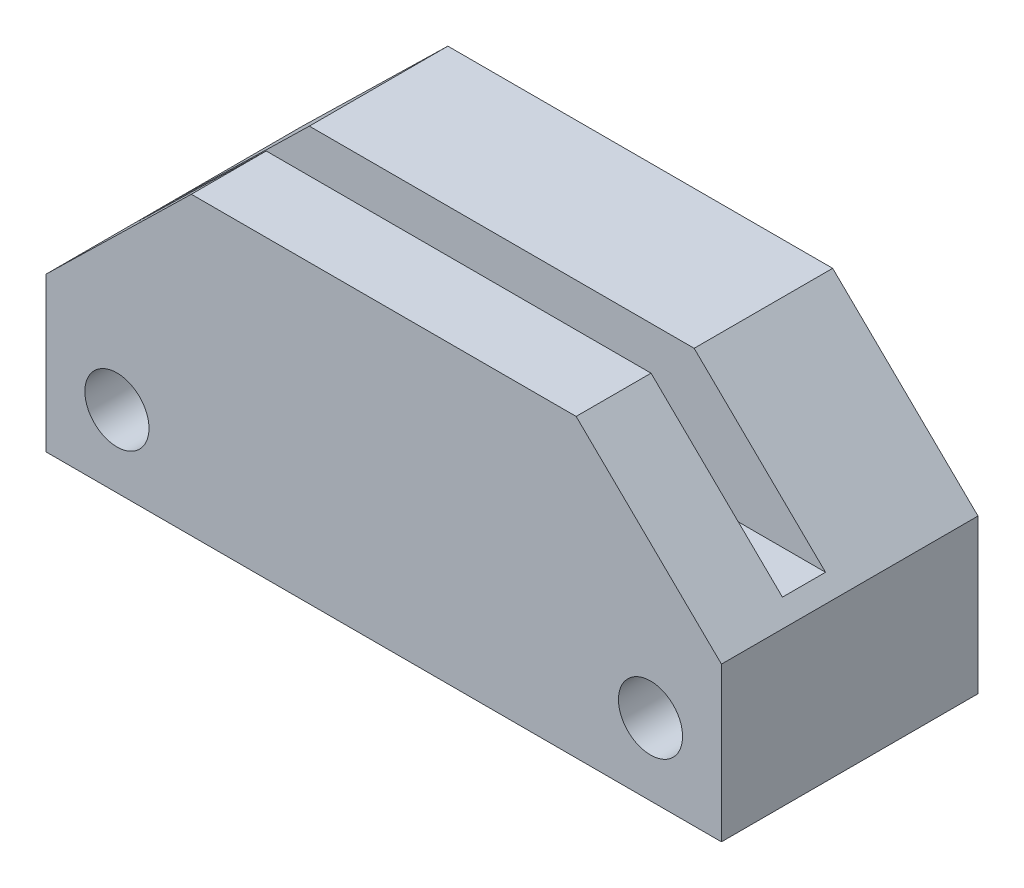
ISO-10303-21;
HEADER;
FILE_DESCRIPTION(('STEP AP214'),'2;1');
FILE_NAME('part.step','',(''),(''),'','','');
FILE_SCHEMA(('AUTOMOTIVE_DESIGN { 1 0 10303 214 1 1 1 1 }'));
ENDSEC;
DATA;
#1=APPLICATION_CONTEXT('core data for automotive mechanical design processes');
#2=APPLICATION_PROTOCOL_DEFINITION('international standard','automotive_design',2000,#1);
#3=PRODUCT_CONTEXT('',#1,'mechanical');
#4=PRODUCT('Part','Part','',(#3));
#5=PRODUCT_RELATED_PRODUCT_CATEGORY('part','',(#4));
#6=PRODUCT_DEFINITION_FORMATION('','',#4);
#7=PRODUCT_DEFINITION_CONTEXT('part definition',#1,'design');
#8=PRODUCT_DEFINITION('design','',#6,#7);
#9=PRODUCT_DEFINITION_SHAPE('','',#8);
#10=(LENGTH_UNIT() NAMED_UNIT(*) SI_UNIT(.MILLI.,.METRE.));
#11=(NAMED_UNIT(*) PLANE_ANGLE_UNIT() SI_UNIT($,.RADIAN.));
#12=(NAMED_UNIT(*) SI_UNIT($,.STERADIAN.) SOLID_ANGLE_UNIT());
#13=UNCERTAINTY_MEASURE_WITH_UNIT(LENGTH_MEASURE(1.E-05),#10,'distance_accuracy_value','');
#14=(GEOMETRIC_REPRESENTATION_CONTEXT(3) GLOBAL_UNCERTAINTY_ASSIGNED_CONTEXT((#13)) GLOBAL_UNIT_ASSIGNED_CONTEXT((#10,
#11,#12)) REPRESENTATION_CONTEXT('',''));
#15=CARTESIAN_POINT('',(0.,0.,0.));
#16=DIRECTION('',(0.,0.,1.));
#17=DIRECTION('',(1.,0.,0.));
#18=AXIS2_PLACEMENT_3D('',#15,#16,#17);
#19=CARTESIAN_POINT('',(5.665,11.53,10.));
#20=DIRECTION('',(0.,-1.,0.));
#21=DIRECTION('',(0.,0.,-1.));
#22=AXIS2_PLACEMENT_3D('',#19,#20,#21);
#23=PLANE('',#22);
#24=DIRECTION('',(0.,0.,-1.));
#25=VECTOR('',#24,1.);
#26=CARTESIAN_POINT('',(5.665,11.53,10.));
#27=LINE('',#26,#25);
#28=CARTESIAN_POINT('',(5.665,11.53,5.4));
#29=VERTEX_POINT('',#28);
#30=CARTESIAN_POINT('',(5.665,11.53,0.));
#31=VERTEX_POINT('',#30);
#32=EDGE_CURVE('E153',#29,#31,#27,.T.);
#33=ORIENTED_EDGE('',*,*,#32,.F.);
#34=DIRECTION('',(-1.,0.,0.));
#35=VECTOR('',#34,1.);
#36=CARTESIAN_POINT('',(0.,11.53,5.4));
#37=LINE('',#36,#35);
#38=CARTESIAN_POINT('',(20.665,11.53,5.4));
#39=VERTEX_POINT('',#38);
#40=EDGE_CURVE('E177',#39,#29,#37,.T.);
#41=ORIENTED_EDGE('',*,*,#40,.F.);
#42=DIRECTION('',(0.,0.,-1.));
#43=VECTOR('',#42,1.);
#44=CARTESIAN_POINT('',(20.665,11.53,10.));
#45=LINE('',#44,#43);
#46=CARTESIAN_POINT('',(20.665,11.53,0.));
#47=VERTEX_POINT('',#46);
#48=EDGE_CURVE('E126',#39,#47,#45,.T.);
#49=ORIENTED_EDGE('',*,*,#48,.T.);
#50=DIRECTION('',(-1.,0.,0.));
#51=VECTOR('',#50,1.);
#52=CARTESIAN_POINT('',(5.665,11.53,0.));
#53=LINE('',#52,#51);
#54=EDGE_CURVE('E147',#47,#31,#53,.T.);
#55=ORIENTED_EDGE('',*,*,#54,.T.);
#56=EDGE_LOOP('',(#33,#41,#49,#55));
#57=FACE_BOUND('',#56,.T.);
#58=ADVANCED_FACE('F34',(#57),#23,.F.);
#59=CARTESIAN_POINT('',(0.,0.,10.));
#60=DIRECTION('',(1.,0.,0.));
#61=DIRECTION('',(0.,0.,-1.));
#62=AXIS2_PLACEMENT_3D('',#59,#60,#61);
#63=PLANE('',#62);
#64=DIRECTION('',(0.,-1.,0.));
#65=VECTOR('',#64,1.);
#66=CARTESIAN_POINT('',(0.,0.,0.));
#67=LINE('',#66,#65);
#68=CARTESIAN_POINT('',(0.,6.,0.));
#69=VERTEX_POINT('',#68);
#70=CARTESIAN_POINT('',(0.,0.,0.));
#71=VERTEX_POINT('',#70);
#72=EDGE_CURVE('E136',#69,#71,#67,.T.);
#73=ORIENTED_EDGE('',*,*,#72,.T.);
#74=DIRECTION('',(0.,0.,-1.));
#75=VECTOR('',#74,1.);
#76=CARTESIAN_POINT('',(0.,0.,10.));
#77=LINE('',#76,#75);
#78=CARTESIAN_POINT('',(0.,0.,10.));
#79=VERTEX_POINT('',#78);
#80=EDGE_CURVE('E159',#79,#71,#77,.T.);
#81=ORIENTED_EDGE('',*,*,#80,.F.);
#82=DIRECTION('',(0.,-1.,0.));
#83=VECTOR('',#82,1.);
#84=CARTESIAN_POINT('',(0.,0.,10.));
#85=LINE('',#84,#83);
#86=CARTESIAN_POINT('',(0.,6.,10.));
#87=VERTEX_POINT('',#86);
#88=EDGE_CURVE('E151',#87,#79,#85,.T.);
#89=ORIENTED_EDGE('',*,*,#88,.F.);
#90=DIRECTION('',(0.,0.,-1.));
#91=VECTOR('',#90,1.);
#92=CARTESIAN_POINT('',(0.,6.,10.));
#93=LINE('',#92,#91);
#94=EDGE_CURVE('E132',#87,#69,#93,.T.);
#95=ORIENTED_EDGE('',*,*,#94,.T.);
#96=EDGE_LOOP('',(#73,#81,#89,#95));
#97=FACE_BOUND('',#96,.T.);
#98=ADVANCED_FACE('F36',(#97),#63,.F.);
#99=CARTESIAN_POINT('',(0.,0.,10.));
#100=DIRECTION('',(0.,1.,0.));
#101=DIRECTION('',(0.,0.,1.));
#102=AXIS2_PLACEMENT_3D('',#99,#100,#101);
#103=PLANE('',#102);
#104=DIRECTION('',(1.,0.,0.));
#105=VECTOR('',#104,1.);
#106=CARTESIAN_POINT('',(0.,0.,0.));
#107=LINE('',#106,#105);
#108=CARTESIAN_POINT('',(26.33,0.,0.));
#109=VERTEX_POINT('',#108);
#110=EDGE_CURVE('E139',#71,#109,#107,.T.);
#111=ORIENTED_EDGE('',*,*,#110,.T.);
#112=DIRECTION('',(0.,0.,-1.));
#113=VECTOR('',#112,1.);
#114=CARTESIAN_POINT('',(26.33,0.,10.));
#115=LINE('',#114,#113);
#116=CARTESIAN_POINT('',(26.33,0.,10.));
#117=VERTEX_POINT('',#116);
#118=EDGE_CURVE('E156',#117,#109,#115,.T.);
#119=ORIENTED_EDGE('',*,*,#118,.F.);
#120=DIRECTION('',(1.,0.,0.));
#121=VECTOR('',#120,1.);
#122=CARTESIAN_POINT('',(0.,0.,10.));
#123=LINE('',#122,#121);
#124=EDGE_CURVE('E93',#79,#117,#123,.T.);
#125=ORIENTED_EDGE('',*,*,#124,.F.);
#126=ORIENTED_EDGE('',*,*,#80,.T.);
#127=EDGE_LOOP('',(#111,#119,#125,#126));
#128=FACE_BOUND('',#127,.T.);
#129=ADVANCED_FACE('F196',(#128),#103,.F.);
#130=CARTESIAN_POINT('',(26.33,0.,10.));
#131=DIRECTION('',(-1.,0.,0.));
#132=DIRECTION('',(0.,0.,1.));
#133=AXIS2_PLACEMENT_3D('',#130,#131,#132);
#134=PLANE('',#133);
#135=DIRECTION('',(0.,1.,0.));
#136=VECTOR('',#135,1.);
#137=CARTESIAN_POINT('',(26.33,0.,0.));
#138=LINE('',#137,#136);
#139=CARTESIAN_POINT('',(26.33,6.,0.));
#140=VERTEX_POINT('',#139);
#141=EDGE_CURVE('E142',#109,#140,#138,.T.);
#142=ORIENTED_EDGE('',*,*,#141,.T.);
#143=DIRECTION('',(0.,0.,-1.));
#144=VECTOR('',#143,1.);
#145=CARTESIAN_POINT('',(26.33,6.,10.));
#146=LINE('',#145,#144);
#147=CARTESIAN_POINT('',(26.33,6.,10.));
#148=VERTEX_POINT('',#147);
#149=EDGE_CURVE('E125',#148,#140,#146,.T.);
#150=ORIENTED_EDGE('',*,*,#149,.F.);
#151=DIRECTION('',(0.,1.,0.));
#152=VECTOR('',#151,1.);
#153=CARTESIAN_POINT('',(26.33,0.,10.));
#154=LINE('',#153,#152);
#155=EDGE_CURVE('E109',#117,#148,#154,.T.);
#156=ORIENTED_EDGE('',*,*,#155,.F.);
#157=ORIENTED_EDGE('',*,*,#118,.T.);
#158=EDGE_LOOP('',(#142,#150,#156,#157));
#159=FACE_BOUND('',#158,.T.);
#160=ADVANCED_FACE('F199',(#159),#134,.F.);
#161=CARTESIAN_POINT('',(20.665,11.53,10.));
#162=DIRECTION('',(-0.698529024771554,-0.715581722482975,0.));
#163=DIRECTION('',(0.715581722482975,-0.698529024771554,0.));
#164=AXIS2_PLACEMENT_3D('',#161,#162,#163);
#165=PLANE('',#164);
#166=ORIENTED_EDGE('',*,*,#48,.F.);
#167=DIRECTION('',(0.715581722482975,-0.698529024771554,0.));
#168=VECTOR('',#167,1.);
#169=CARTESIAN_POINT('',(20.665,11.53,5.4));
#170=LINE('',#169,#168);
#171=CARTESIAN_POINT('',(25.787061482821,6.53,5.4));
#172=VERTEX_POINT('',#171);
#173=EDGE_CURVE('E140',#39,#172,#170,.T.);
#174=ORIENTED_EDGE('',*,*,#173,.T.);
#175=DIRECTION('',(0.,0.,-1.));
#176=VECTOR('',#175,1.);
#177=CARTESIAN_POINT('',(25.787061482821,6.53,10.));
#178=LINE('',#177,#176);
#179=CARTESIAN_POINT('',(25.787061482821,6.53,7.08));
#180=VERTEX_POINT('',#179);
#181=EDGE_CURVE('E188',#180,#172,#178,.T.);
#182=ORIENTED_EDGE('',*,*,#181,.F.);
#183=DIRECTION('',(-0.715581722482975,0.698529024771554,0.));
#184=VECTOR('',#183,1.);
#185=CARTESIAN_POINT('',(20.665,11.53,7.08));
#186=LINE('',#185,#184);
#187=CARTESIAN_POINT('',(20.665,11.53,7.08));
#188=VERTEX_POINT('',#187);
#189=EDGE_CURVE('E122',#180,#188,#186,.T.);
#190=ORIENTED_EDGE('',*,*,#189,.T.);
#191=CARTESIAN_POINT('',(20.665,11.53,10.));
#192=VERTEX_POINT('',#191);
#193=EDGE_CURVE('E116',#192,#188,#45,.T.);
#194=ORIENTED_EDGE('',*,*,#193,.F.);
#195=DIRECTION('',(-0.715581722482975,0.698529024771554,0.));
#196=VECTOR('',#195,1.);
#197=CARTESIAN_POINT('',(20.665,11.53,10.));
#198=LINE('',#197,#196);
#199=EDGE_CURVE('E102',#148,#192,#198,.T.);
#200=ORIENTED_EDGE('',*,*,#199,.F.);
#201=ORIENTED_EDGE('',*,*,#149,.T.);
#202=DIRECTION('',(-0.715581722482975,0.698529024771554,0.));
#203=VECTOR('',#202,1.);
#204=CARTESIAN_POINT('',(20.665,11.53,0.));
#205=LINE('',#204,#203);
#206=EDGE_CURVE('E144',#140,#47,#205,.T.);
#207=ORIENTED_EDGE('',*,*,#206,.T.);
#208=EDGE_LOOP('',(#166,#174,#182,#190,#194,#200,#201,#207));
#209=FACE_BOUND('',#208,.T.);
#210=ADVANCED_FACE('F118',(#209),#165,.F.);
#211=ORIENTED_EDGE('',*,*,#193,.T.);
#212=DIRECTION('',(1.,0.,0.));
#213=VECTOR('',#212,1.);
#214=CARTESIAN_POINT('',(0.,11.53,7.08));
#215=LINE('',#214,#213);
#216=CARTESIAN_POINT('',(5.665,11.53,7.08));
#217=VERTEX_POINT('',#216);
#218=EDGE_CURVE('E173',#217,#188,#215,.T.);
#219=ORIENTED_EDGE('',*,*,#218,.F.);
#220=CARTESIAN_POINT('',(5.665,11.53,10.));
#221=VERTEX_POINT('',#220);
#222=EDGE_CURVE('E130',#221,#217,#27,.T.);
#223=ORIENTED_EDGE('',*,*,#222,.F.);
#224=DIRECTION('',(-1.,0.,0.));
#225=VECTOR('',#224,1.);
#226=CARTESIAN_POINT('',(5.665,11.53,10.));
#227=LINE('',#226,#225);
#228=EDGE_CURVE('E106',#192,#221,#227,.T.);
#229=ORIENTED_EDGE('',*,*,#228,.F.);
#230=EDGE_LOOP('',(#211,#219,#223,#229));
#231=FACE_BOUND('',#230,.T.);
#232=ADVANCED_FACE('F128',(#231),#23,.F.);
#233=CARTESIAN_POINT('',(0.,6.,10.));
#234=DIRECTION('',(0.698529024771554,-0.715581722482975,0.));
#235=DIRECTION('',(0.715581722482975,0.698529024771554,0.));
#236=AXIS2_PLACEMENT_3D('',#233,#234,#235);
#237=PLANE('',#236);
#238=DIRECTION('',(0.,0.,1.));
#239=VECTOR('',#238,1.);
#240=CARTESIAN_POINT('',(0.542938517179022,6.53,10.));
#241=LINE('',#240,#239);
#242=CARTESIAN_POINT('',(0.542938517179022,6.53,5.4));
#243=VERTEX_POINT('',#242);
#244=CARTESIAN_POINT('',(0.542938517179022,6.53,7.08));
#245=VERTEX_POINT('',#244);
#246=EDGE_CURVE('E161',#243,#245,#241,.T.);
#247=ORIENTED_EDGE('',*,*,#246,.F.);
#248=DIRECTION('',(0.715581722482975,0.698529024771554,0.));
#249=VECTOR('',#248,1.);
#250=CARTESIAN_POINT('',(0.,6.,5.4));
#251=LINE('',#250,#249);
#252=EDGE_CURVE('E11',#243,#29,#251,.T.);
#253=ORIENTED_EDGE('',*,*,#252,.T.);
#254=ORIENTED_EDGE('',*,*,#32,.T.);
#255=DIRECTION('',(-0.715581722482975,-0.698529024771554,0.));
#256=VECTOR('',#255,1.);
#257=CARTESIAN_POINT('',(0.,6.,0.));
#258=LINE('',#257,#256);
#259=EDGE_CURVE('E84',#31,#69,#258,.T.);
#260=ORIENTED_EDGE('',*,*,#259,.T.);
#261=ORIENTED_EDGE('',*,*,#94,.F.);
#262=DIRECTION('',(-0.715581722482975,-0.698529024771554,0.));
#263=VECTOR('',#262,1.);
#264=CARTESIAN_POINT('',(0.,6.,10.));
#265=LINE('',#264,#263);
#266=EDGE_CURVE('E58',#221,#87,#265,.T.);
#267=ORIENTED_EDGE('',*,*,#266,.F.);
#268=ORIENTED_EDGE('',*,*,#222,.T.);
#269=DIRECTION('',(-0.715581722482975,-0.698529024771554,0.));
#270=VECTOR('',#269,1.);
#271=CARTESIAN_POINT('',(0.,6.,7.08));
#272=LINE('',#271,#270);
#273=EDGE_CURVE('E42',#217,#245,#272,.T.);
#274=ORIENTED_EDGE('',*,*,#273,.T.);
#275=EDGE_LOOP('',(#247,#253,#254,#260,#261,#267,#268,#274));
#276=FACE_BOUND('',#275,.T.);
#277=ADVANCED_FACE('F166',(#276),#237,.F.);
#278=CARTESIAN_POINT('',(0.,0.,10.));
#279=DIRECTION('',(0.,0.,-1.));
#280=DIRECTION('',(-1.,0.,0.));
#281=AXIS2_PLACEMENT_3D('',#278,#279,#280);
#282=PLANE('',#281);
#283=CARTESIAN_POINT('',(23.565,2.79999999999999,10.));
#284=DIRECTION('',(0.,0.,-1.));
#285=DIRECTION('',(-1.,0.,0.));
#286=AXIS2_PLACEMENT_3D('',#283,#284,#285);
#287=CIRCLE('',#286,1.25);
#288=CARTESIAN_POINT('',(22.315,2.79999999999999,10.));
#289=VERTEX_POINT('',#288);
#290=EDGE_CURVE('E178',#289,#289,#287,.F.);
#291=ORIENTED_EDGE('',*,*,#290,.F.);
#292=EDGE_LOOP('',(#291));
#293=FACE_BOUND('',#292,.T.);
#294=CARTESIAN_POINT('',(2.765,2.8,10.));
#295=DIRECTION('',(0.,0.,-1.));
#296=DIRECTION('',(-1.,0.,0.));
#297=AXIS2_PLACEMENT_3D('',#294,#295,#296);
#298=CIRCLE('',#297,1.25);
#299=CARTESIAN_POINT('',(1.515,2.8,10.));
#300=VERTEX_POINT('',#299);
#301=EDGE_CURVE('E219',#300,#300,#298,.F.);
#302=ORIENTED_EDGE('',*,*,#301,.F.);
#303=EDGE_LOOP('',(#302));
#304=FACE_BOUND('',#303,.T.);
#305=ORIENTED_EDGE('',*,*,#88,.T.);
#306=ORIENTED_EDGE('',*,*,#124,.T.);
#307=ORIENTED_EDGE('',*,*,#155,.T.);
#308=ORIENTED_EDGE('',*,*,#199,.T.);
#309=ORIENTED_EDGE('',*,*,#228,.T.);
#310=ORIENTED_EDGE('',*,*,#266,.T.);
#311=EDGE_LOOP('',(#305,#306,#307,#308,#309,#310));
#312=FACE_BOUND('',#311,.T.);
#313=ADVANCED_FACE('F104',(#293,#304,#312),#282,.F.);
#314=CARTESIAN_POINT('',(0.,0.,0.));
#315=DIRECTION('',(0.,0.,-1.));
#316=DIRECTION('',(-1.,0.,0.));
#317=AXIS2_PLACEMENT_3D('',#314,#315,#316);
#318=PLANE('',#317);
#319=CARTESIAN_POINT('',(23.565,2.79999999999999,0.));
#320=DIRECTION('',(0.,0.,-1.));
#321=DIRECTION('',(-1.,0.,0.));
#322=AXIS2_PLACEMENT_3D('',#319,#320,#321);
#323=CIRCLE('',#322,1.25);
#324=CARTESIAN_POINT('',(22.315,2.79999999999999,0.));
#325=VERTEX_POINT('',#324);
#326=EDGE_CURVE('E183',#325,#325,#323,.T.);
#327=ORIENTED_EDGE('',*,*,#326,.F.);
#328=EDGE_LOOP('',(#327));
#329=FACE_BOUND('',#328,.T.);
#330=CARTESIAN_POINT('',(2.765,2.8,0.));
#331=DIRECTION('',(0.,0.,-1.));
#332=DIRECTION('',(-1.,0.,0.));
#333=AXIS2_PLACEMENT_3D('',#330,#331,#332);
#334=CIRCLE('',#333,1.25);
#335=CARTESIAN_POINT('',(1.515,2.8,0.));
#336=VERTEX_POINT('',#335);
#337=EDGE_CURVE('E222',#336,#336,#334,.T.);
#338=ORIENTED_EDGE('',*,*,#337,.F.);
#339=EDGE_LOOP('',(#338));
#340=FACE_BOUND('',#339,.T.);
#341=ORIENTED_EDGE('',*,*,#72,.F.);
#342=ORIENTED_EDGE('',*,*,#259,.F.);
#343=ORIENTED_EDGE('',*,*,#54,.F.);
#344=ORIENTED_EDGE('',*,*,#206,.F.);
#345=ORIENTED_EDGE('',*,*,#141,.F.);
#346=ORIENTED_EDGE('',*,*,#110,.F.);
#347=EDGE_LOOP('',(#341,#342,#343,#344,#345,#346));
#348=FACE_BOUND('',#347,.T.);
#349=ADVANCED_FACE('F204',(#329,#340,#348),#318,.T.);
#350=CARTESIAN_POINT('',(0.,6.53,5.4));
#351=DIRECTION('',(0.,0.,-1.));
#352=DIRECTION('',(-1.,0.,0.));
#353=AXIS2_PLACEMENT_3D('',#350,#351,#352);
#354=PLANE('',#353);
#355=ORIENTED_EDGE('',*,*,#40,.T.);
#356=ORIENTED_EDGE('',*,*,#252,.F.);
#357=DIRECTION('',(-1.,0.,0.));
#358=VECTOR('',#357,1.);
#359=CARTESIAN_POINT('',(0.,6.53,5.4));
#360=LINE('',#359,#358);
#361=EDGE_CURVE('E49',#172,#243,#360,.T.);
#362=ORIENTED_EDGE('',*,*,#361,.F.);
#363=ORIENTED_EDGE('',*,*,#173,.F.);
#364=EDGE_LOOP('',(#355,#356,#362,#363));
#365=FACE_BOUND('',#364,.T.);
#366=ADVANCED_FACE('F217',(#365),#354,.F.);
#367=CARTESIAN_POINT('',(0.,6.53,7.08));
#368=DIRECTION('',(0.,0.,1.));
#369=DIRECTION('',(1.,0.,0.));
#370=AXIS2_PLACEMENT_3D('',#367,#368,#369);
#371=PLANE('',#370);
#372=DIRECTION('',(1.,0.,0.));
#373=VECTOR('',#372,1.);
#374=CARTESIAN_POINT('',(0.,6.53,7.08));
#375=LINE('',#374,#373);
#376=EDGE_CURVE('E175',#245,#180,#375,.T.);
#377=ORIENTED_EDGE('',*,*,#376,.F.);
#378=ORIENTED_EDGE('',*,*,#273,.F.);
#379=ORIENTED_EDGE('',*,*,#218,.T.);
#380=ORIENTED_EDGE('',*,*,#189,.F.);
#381=EDGE_LOOP('',(#377,#378,#379,#380));
#382=FACE_BOUND('',#381,.T.);
#383=ADVANCED_FACE('F172',(#382),#371,.F.);
#384=CARTESIAN_POINT('',(0.,6.53,0.));
#385=DIRECTION('',(0.,1.,0.));
#386=DIRECTION('',(0.,0.,1.));
#387=AXIS2_PLACEMENT_3D('',#384,#385,#386);
#388=PLANE('',#387);
#389=ORIENTED_EDGE('',*,*,#181,.T.);
#390=ORIENTED_EDGE('',*,*,#361,.T.);
#391=ORIENTED_EDGE('',*,*,#246,.T.);
#392=ORIENTED_EDGE('',*,*,#376,.T.);
#393=EDGE_LOOP('',(#389,#390,#391,#392));
#394=FACE_BOUND('',#393,.T.);
#395=ADVANCED_FACE('F216',(#394),#388,.T.);
#396=CARTESIAN_POINT('',(2.765,2.8,10.001));
#397=DIRECTION('',(0.,0.,-1.));
#398=DIRECTION('',(-1.,0.,0.));
#399=AXIS2_PLACEMENT_3D('',#396,#397,#398);
#400=CYLINDRICAL_SURFACE('',#399,1.25);
#401=ORIENTED_EDGE('',*,*,#337,.T.);
#402=EDGE_LOOP('',(#401));
#403=FACE_BOUND('',#402,.T.);
#404=ORIENTED_EDGE('',*,*,#301,.T.);
#405=EDGE_LOOP('',(#404));
#406=FACE_BOUND('',#405,.T.);
#407=ADVANCED_FACE('F236',(#403,#406),#400,.F.);
#408=CARTESIAN_POINT('',(23.565,2.79999999999999,10.001));
#409=DIRECTION('',(0.,0.,-1.));
#410=DIRECTION('',(-1.,0.,0.));
#411=AXIS2_PLACEMENT_3D('',#408,#409,#410);
#412=CYLINDRICAL_SURFACE('',#411,1.25);
#413=ORIENTED_EDGE('',*,*,#326,.T.);
#414=EDGE_LOOP('',(#413));
#415=FACE_BOUND('',#414,.T.);
#416=ORIENTED_EDGE('',*,*,#290,.T.);
#417=EDGE_LOOP('',(#416));
#418=FACE_BOUND('',#417,.T.);
#419=ADVANCED_FACE('F228',(#415,#418),#412,.F.);
#420=CLOSED_SHELL('',(#58,#98,#129,#160,#210,#232,#277,#313,#349,#366,#383,#395,#407,#419));
#421=MANIFOLD_SOLID_BREP('B2',#420);
#422=ADVANCED_BREP_SHAPE_REPRESENTATION('',(#18,#421),#14);
#423=SHAPE_DEFINITION_REPRESENTATION(#9,#422);
ENDSEC;
END-ISO-10303-21;
